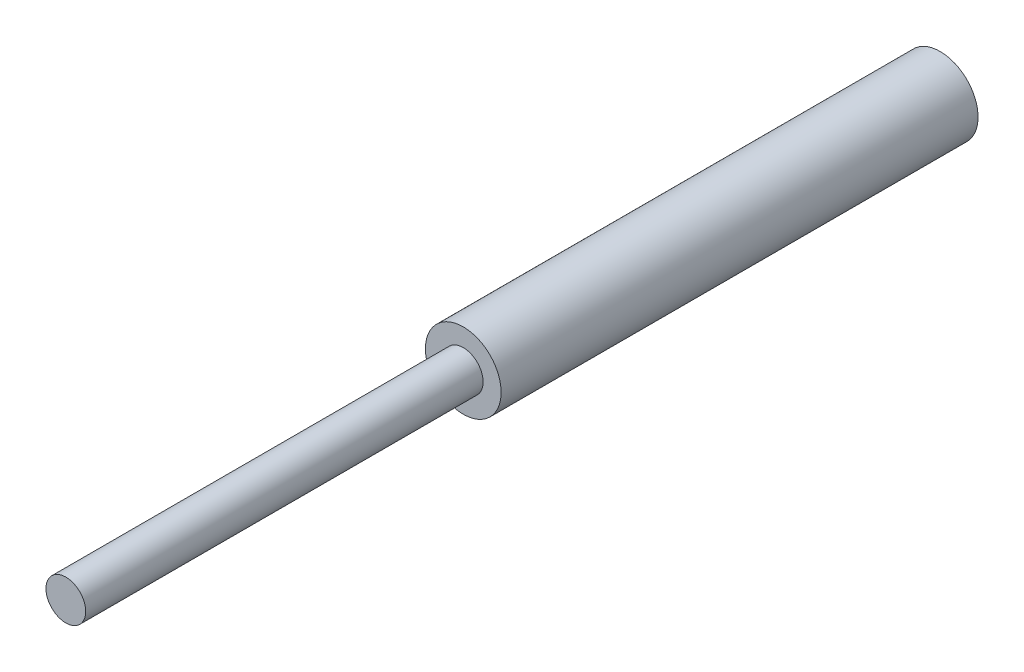
ISO-10303-21;
HEADER;
FILE_DESCRIPTION(('STEP AP214'),'2;1');
FILE_NAME('part.step','',(''),(''),'','','');
FILE_SCHEMA(('AUTOMOTIVE_DESIGN { 1 0 10303 214 1 1 1 1 }'));
ENDSEC;
DATA;
#1=APPLICATION_CONTEXT('core data for automotive mechanical design processes');
#2=APPLICATION_PROTOCOL_DEFINITION('international standard','automotive_design',2000,#1);
#3=PRODUCT_CONTEXT('',#1,'mechanical');
#4=PRODUCT('Part','Part','',(#3));
#5=PRODUCT_RELATED_PRODUCT_CATEGORY('part','',(#4));
#6=PRODUCT_DEFINITION_FORMATION('','',#4);
#7=PRODUCT_DEFINITION_CONTEXT('part definition',#1,'design');
#8=PRODUCT_DEFINITION('design','',#6,#7);
#9=PRODUCT_DEFINITION_SHAPE('','',#8);
#10=(LENGTH_UNIT() NAMED_UNIT(*) SI_UNIT(.MILLI.,.METRE.));
#11=(NAMED_UNIT(*) PLANE_ANGLE_UNIT() SI_UNIT($,.RADIAN.));
#12=(NAMED_UNIT(*) SI_UNIT($,.STERADIAN.) SOLID_ANGLE_UNIT());
#13=UNCERTAINTY_MEASURE_WITH_UNIT(LENGTH_MEASURE(1.E-05),#10,'distance_accuracy_value','');
#14=(GEOMETRIC_REPRESENTATION_CONTEXT(3) GLOBAL_UNCERTAINTY_ASSIGNED_CONTEXT((#13)) GLOBAL_UNIT_ASSIGNED_CONTEXT((#10,
#11,#12)) REPRESENTATION_CONTEXT('',''));
#15=CARTESIAN_POINT('',(0.,0.,0.));
#16=DIRECTION('',(0.,0.,1.));
#17=DIRECTION('',(1.,0.,0.));
#18=AXIS2_PLACEMENT_3D('',#15,#16,#17);
#19=CARTESIAN_POINT('',(0.,0.,50.));
#20=DIRECTION('',(0.,0.,-1.));
#21=DIRECTION('',(-1.,0.,0.));
#22=AXIS2_PLACEMENT_3D('',#19,#20,#21);
#23=CYLINDRICAL_SURFACE('',#22,2.5);
#24=CARTESIAN_POINT('',(0.,0.,50.));
#25=DIRECTION('',(0.,0.,1.));
#26=DIRECTION('',(1.,0.,0.));
#27=AXIS2_PLACEMENT_3D('',#24,#25,#26);
#28=CIRCLE('',#27,2.5);
#29=CARTESIAN_POINT('',(2.5,0.,50.));
#30=VERTEX_POINT('',#29);
#31=EDGE_CURVE('E10',#30,#30,#28,.T.);
#32=ORIENTED_EDGE('',*,*,#31,.F.);
#33=EDGE_LOOP('',(#32));
#34=FACE_BOUND('',#33,.T.);
#35=CARTESIAN_POINT('',(0.,0.,0.));
#36=DIRECTION('',(0.,0.,1.));
#37=DIRECTION('',(1.,0.,0.));
#38=AXIS2_PLACEMENT_3D('',#35,#36,#37);
#39=CIRCLE('',#38,2.5);
#40=CARTESIAN_POINT('',(2.5,0.,0.));
#41=VERTEX_POINT('',#40);
#42=EDGE_CURVE('E34',#41,#41,#39,.T.);
#43=ORIENTED_EDGE('',*,*,#42,.T.);
#44=EDGE_LOOP('',(#43));
#45=FACE_BOUND('',#44,.T.);
#46=ADVANCED_FACE('F31',(#34,#45),#23,.T.);
#47=CARTESIAN_POINT('',(0.,0.,50.));
#48=DIRECTION('',(0.,0.,1.));
#49=DIRECTION('',(1.,0.,0.));
#50=AXIS2_PLACEMENT_3D('',#47,#48,#49);
#51=PLANE('',#50);
#52=ORIENTED_EDGE('',*,*,#31,.T.);
#53=EDGE_LOOP('',(#52));
#54=FACE_BOUND('',#53,.T.);
#55=ADVANCED_FACE('F54',(#54),#51,.T.);
#56=CARTESIAN_POINT('',(0.,0.,-60.));
#57=DIRECTION('',(0.,0.,1.));
#58=DIRECTION('',(1.,0.,0.));
#59=AXIS2_PLACEMENT_3D('',#56,#57,#58);
#60=CYLINDRICAL_SURFACE('',#59,4.7625);
#61=CARTESIAN_POINT('',(0.,0.,-60.));
#62=DIRECTION('',(0.,0.,-1.));
#63=DIRECTION('',(-1.,0.,0.));
#64=AXIS2_PLACEMENT_3D('',#61,#62,#63);
#65=CIRCLE('',#64,4.7625);
#66=CARTESIAN_POINT('',(-4.7625,0.,-60.));
#67=VERTEX_POINT('',#66);
#68=EDGE_CURVE('E41',#67,#67,#65,.T.);
#69=ORIENTED_EDGE('',*,*,#68,.F.);
#70=EDGE_LOOP('',(#69));
#71=FACE_BOUND('',#70,.T.);
#72=CARTESIAN_POINT('',(0.,0.,0.));
#73=DIRECTION('',(0.,0.,-1.));
#74=DIRECTION('',(-1.,0.,0.));
#75=AXIS2_PLACEMENT_3D('',#72,#73,#74);
#76=CIRCLE('',#75,4.7625);
#77=CARTESIAN_POINT('',(-4.7625,0.,0.));
#78=VERTEX_POINT('',#77);
#79=EDGE_CURVE('E43',#78,#78,#76,.T.);
#80=ORIENTED_EDGE('',*,*,#79,.T.);
#81=EDGE_LOOP('',(#80));
#82=FACE_BOUND('',#81,.T.);
#83=ADVANCED_FACE('F51',(#71,#82),#60,.T.);
#84=CARTESIAN_POINT('',(0.,0.,-60.));
#85=DIRECTION('',(0.,0.,-1.));
#86=DIRECTION('',(-1.,0.,0.));
#87=AXIS2_PLACEMENT_3D('',#84,#85,#86);
#88=PLANE('',#87);
#89=ORIENTED_EDGE('',*,*,#68,.T.);
#90=EDGE_LOOP('',(#89));
#91=FACE_BOUND('',#90,.T.);
#92=ADVANCED_FACE('F49',(#91),#88,.T.);
#93=CARTESIAN_POINT('',(0.,0.,0.));
#94=DIRECTION('',(0.,0.,-1.));
#95=DIRECTION('',(-1.,0.,0.));
#96=AXIS2_PLACEMENT_3D('',#93,#94,#95);
#97=PLANE('',#96);
#98=ORIENTED_EDGE('',*,*,#42,.F.);
#99=EDGE_LOOP('',(#98));
#100=FACE_BOUND('',#99,.T.);
#101=ORIENTED_EDGE('',*,*,#79,.F.);
#102=EDGE_LOOP('',(#101));
#103=FACE_BOUND('',#102,.T.);
#104=ADVANCED_FACE('F58',(#100,#103),#97,.F.);
#105=CLOSED_SHELL('',(#46,#55,#83,#92,#104));
#106=MANIFOLD_SOLID_BREP('B2',#105);
#107=ADVANCED_BREP_SHAPE_REPRESENTATION('',(#18,#106),#14);
#108=SHAPE_DEFINITION_REPRESENTATION(#9,#107);
ENDSEC;
END-ISO-10303-21;
